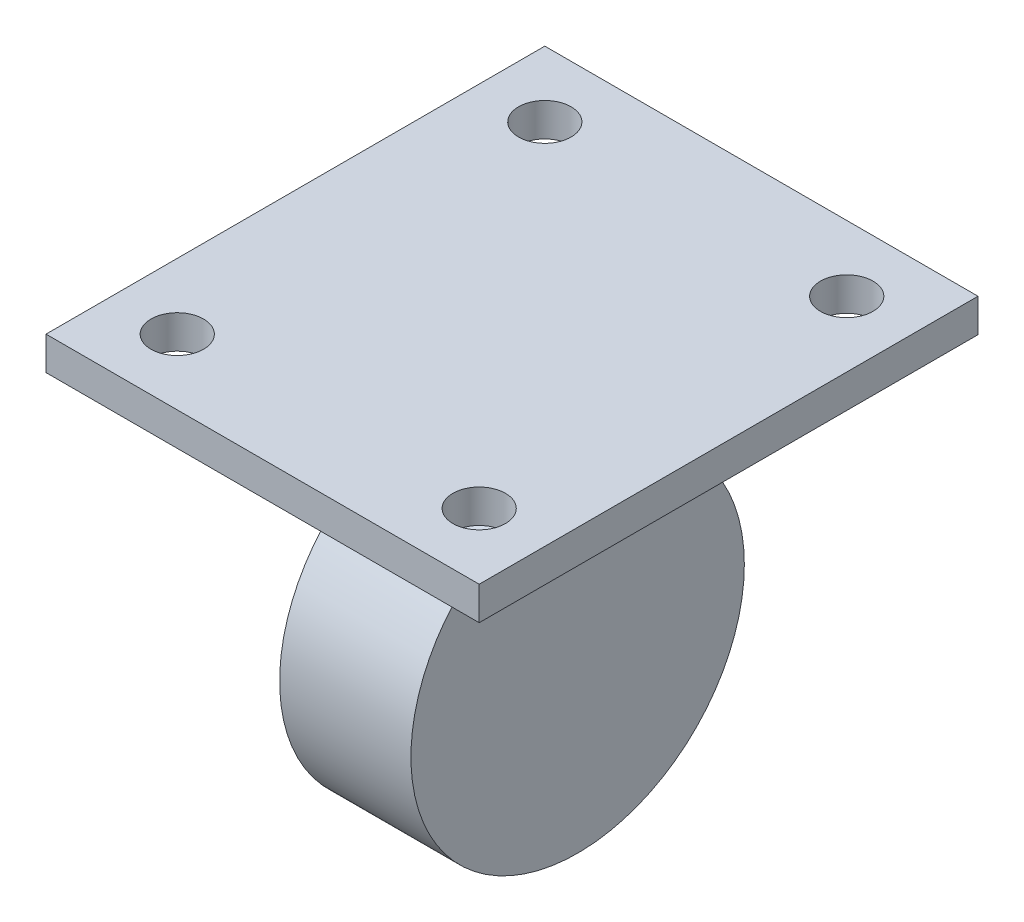
ISO-10303-21;
HEADER;
FILE_DESCRIPTION(('STEP AP214'),'2;1');
FILE_NAME('part.step','',(''),(''),'','','');
FILE_SCHEMA(('AUTOMOTIVE_DESIGN { 1 0 10303 214 1 1 1 1 }'));
ENDSEC;
DATA;
#1=APPLICATION_CONTEXT('core data for automotive mechanical design processes');
#2=APPLICATION_PROTOCOL_DEFINITION('international standard','automotive_design',2000,#1);
#3=PRODUCT_CONTEXT('',#1,'mechanical');
#4=PRODUCT('Part','Part','',(#3));
#5=PRODUCT_RELATED_PRODUCT_CATEGORY('part','',(#4));
#6=PRODUCT_DEFINITION_FORMATION('','',#4);
#7=PRODUCT_DEFINITION_CONTEXT('part definition',#1,'design');
#8=PRODUCT_DEFINITION('design','',#6,#7);
#9=PRODUCT_DEFINITION_SHAPE('','',#8);
#10=(LENGTH_UNIT() NAMED_UNIT(*) SI_UNIT(.MILLI.,.METRE.));
#11=(NAMED_UNIT(*) PLANE_ANGLE_UNIT() SI_UNIT($,.RADIAN.));
#12=(NAMED_UNIT(*) SI_UNIT($,.STERADIAN.) SOLID_ANGLE_UNIT());
#13=UNCERTAINTY_MEASURE_WITH_UNIT(LENGTH_MEASURE(1.E-05),#10,'distance_accuracy_value','');
#14=(GEOMETRIC_REPRESENTATION_CONTEXT(3) GLOBAL_UNCERTAINTY_ASSIGNED_CONTEXT((#13)) GLOBAL_UNIT_ASSIGNED_CONTEXT((#10,
#11,#12)) REPRESENTATION_CONTEXT('',''));
#15=CARTESIAN_POINT('',(0.,0.,0.));
#16=DIRECTION('',(0.,0.,1.));
#17=DIRECTION('',(1.,0.,0.));
#18=AXIS2_PLACEMENT_3D('',#15,#16,#17);
#19=CARTESIAN_POINT('',(5.,-19.8,103.));
#20=DIRECTION('',(-1.,0.,0.));
#21=DIRECTION('',(0.,0.,1.));
#22=AXIS2_PLACEMENT_3D('',#19,#20,#21);
#23=CYLINDRICAL_SURFACE('',#22,12.7);
#24=CARTESIAN_POINT('',(5.,-19.8,103.));
#25=DIRECTION('',(1.,0.,0.));
#26=DIRECTION('',(0.,0.,-1.));
#27=AXIS2_PLACEMENT_3D('',#24,#25,#26);
#28=CIRCLE('',#27,12.7);
#29=CARTESIAN_POINT('',(5.,-19.8,90.3));
#30=VERTEX_POINT('',#29);
#31=EDGE_CURVE('E11',#30,#30,#28,.T.);
#32=ORIENTED_EDGE('',*,*,#31,.F.);
#33=EDGE_LOOP('',(#32));
#34=FACE_BOUND('',#33,.T.);
#35=CARTESIAN_POINT('',(-5.,-19.8,103.));
#36=DIRECTION('',(1.,0.,0.));
#37=DIRECTION('',(0.,0.,-1.));
#38=AXIS2_PLACEMENT_3D('',#35,#36,#37);
#39=CIRCLE('',#38,12.7);
#40=CARTESIAN_POINT('',(-5.,-19.8,90.3));
#41=VERTEX_POINT('',#40);
#42=EDGE_CURVE('E44',#41,#41,#39,.T.);
#43=ORIENTED_EDGE('',*,*,#42,.T.);
#44=EDGE_LOOP('',(#43));
#45=FACE_BOUND('',#44,.T.);
#46=ADVANCED_FACE('F41',(#34,#45),#23,.T.);
#47=CARTESIAN_POINT('',(5.,-19.8,103.));
#48=DIRECTION('',(1.,0.,0.));
#49=DIRECTION('',(0.,0.,-1.));
#50=AXIS2_PLACEMENT_3D('',#47,#48,#49);
#51=PLANE('',#50);
#52=ORIENTED_EDGE('',*,*,#31,.T.);
#53=EDGE_LOOP('',(#52));
#54=FACE_BOUND('',#53,.T.);
#55=ADVANCED_FACE('F56',(#54),#51,.T.);
#56=CARTESIAN_POINT('',(-5.,-19.8,103.));
#57=DIRECTION('',(1.,0.,0.));
#58=DIRECTION('',(0.,0.,-1.));
#59=AXIS2_PLACEMENT_3D('',#56,#57,#58);
#60=PLANE('',#59);
#61=ORIENTED_EDGE('',*,*,#42,.F.);
#62=EDGE_LOOP('',(#61));
#63=FACE_BOUND('',#62,.T.);
#64=ADVANCED_FACE('F54',(#63),#60,.F.);
#65=CLOSED_SHELL('',(#46,#55,#64));
#66=MANIFOLD_SOLID_BREP('B2',#65);
#67=CARTESIAN_POINT('',(-16.5,-2.04000000000001,122.));
#68=DIRECTION('',(-1.,0.,0.));
#69=DIRECTION('',(0.,0.,1.));
#70=AXIS2_PLACEMENT_3D('',#67,#68,#69);
#71=PLANE('',#70);
#72=DIRECTION('',(0.,0.,1.));
#73=VECTOR('',#72,1.);
#74=CARTESIAN_POINT('',(-16.5,0.499999999999994,122.));
#75=LINE('',#74,#73);
#76=CARTESIAN_POINT('',(-16.5,0.499999999999994,84.));
#77=VERTEX_POINT('',#76);
#78=CARTESIAN_POINT('',(-16.5,0.499999999999994,122.));
#79=VERTEX_POINT('',#78);
#80=EDGE_CURVE('E147',#77,#79,#75,.T.);
#81=ORIENTED_EDGE('',*,*,#80,.F.);
#82=DIRECTION('',(0.,1.,0.));
#83=VECTOR('',#82,1.);
#84=CARTESIAN_POINT('',(-16.5,-2.04000000000001,84.));
#85=LINE('',#84,#83);
#86=CARTESIAN_POINT('',(-16.5,-2.04000000000001,84.));
#87=VERTEX_POINT('',#86);
#88=EDGE_CURVE('E39',#87,#77,#85,.T.);
#89=ORIENTED_EDGE('',*,*,#88,.F.);
#90=DIRECTION('',(0.,0.,1.));
#91=VECTOR('',#90,1.);
#92=CARTESIAN_POINT('',(-16.5,-2.04000000000001,122.));
#93=LINE('',#92,#91);
#94=CARTESIAN_POINT('',(-16.5,-2.04000000000001,122.));
#95=VERTEX_POINT('',#94);
#96=EDGE_CURVE('E140',#87,#95,#93,.T.);
#97=ORIENTED_EDGE('',*,*,#96,.T.);
#98=DIRECTION('',(0.,1.,0.));
#99=VECTOR('',#98,1.);
#100=CARTESIAN_POINT('',(-16.5,-2.04000000000001,122.));
#101=LINE('',#100,#99);
#102=EDGE_CURVE('E85',#95,#79,#101,.T.);
#103=ORIENTED_EDGE('',*,*,#102,.T.);
#104=EDGE_LOOP('',(#81,#89,#97,#103));
#105=FACE_BOUND('',#104,.T.);
#106=ADVANCED_FACE('F82',(#105),#71,.T.);
#107=CARTESIAN_POINT('',(-16.5,-2.04000000000001,84.));
#108=DIRECTION('',(0.,0.,-1.));
#109=DIRECTION('',(-1.,0.,0.));
#110=AXIS2_PLACEMENT_3D('',#107,#108,#109);
#111=PLANE('',#110);
#112=DIRECTION('',(-1.,0.,0.));
#113=VECTOR('',#112,1.);
#114=CARTESIAN_POINT('',(-16.5,0.499999999999994,84.));
#115=LINE('',#114,#113);
#116=CARTESIAN_POINT('',(16.5,0.499999999999994,84.));
#117=VERTEX_POINT('',#116);
#118=EDGE_CURVE('E142',#117,#77,#115,.T.);
#119=ORIENTED_EDGE('',*,*,#118,.F.);
#120=DIRECTION('',(0.,1.,0.));
#121=VECTOR('',#120,1.);
#122=CARTESIAN_POINT('',(16.5,-2.04000000000001,84.));
#123=LINE('',#122,#121);
#124=CARTESIAN_POINT('',(16.5,-2.04000000000001,84.));
#125=VERTEX_POINT('',#124);
#126=EDGE_CURVE('E91',#125,#117,#123,.T.);
#127=ORIENTED_EDGE('',*,*,#126,.F.);
#128=DIRECTION('',(-1.,0.,0.));
#129=VECTOR('',#128,1.);
#130=CARTESIAN_POINT('',(-16.5,-2.04000000000001,84.));
#131=LINE('',#130,#129);
#132=EDGE_CURVE('E137',#125,#87,#131,.T.);
#133=ORIENTED_EDGE('',*,*,#132,.T.);
#134=ORIENTED_EDGE('',*,*,#88,.T.);
#135=EDGE_LOOP('',(#119,#127,#133,#134));
#136=FACE_BOUND('',#135,.T.);
#137=ADVANCED_FACE('F158',(#136),#111,.T.);
#138=CARTESIAN_POINT('',(16.5,-2.04000000000001,122.));
#139=DIRECTION('',(1.,0.,0.));
#140=DIRECTION('',(0.,0.,-1.));
#141=AXIS2_PLACEMENT_3D('',#138,#139,#140);
#142=PLANE('',#141);
#143=DIRECTION('',(0.,0.,-1.));
#144=VECTOR('',#143,1.);
#145=CARTESIAN_POINT('',(16.5,0.499999999999994,122.));
#146=LINE('',#145,#144);
#147=CARTESIAN_POINT('',(16.5,0.499999999999994,122.));
#148=VERTEX_POINT('',#147);
#149=EDGE_CURVE('E132',#148,#117,#146,.T.);
#150=ORIENTED_EDGE('',*,*,#149,.F.);
#151=DIRECTION('',(0.,1.,0.));
#152=VECTOR('',#151,1.);
#153=CARTESIAN_POINT('',(16.5,-2.04000000000001,122.));
#154=LINE('',#153,#152);
#155=CARTESIAN_POINT('',(16.5,-2.04000000000001,122.));
#156=VERTEX_POINT('',#155);
#157=EDGE_CURVE('E127',#156,#148,#154,.T.);
#158=ORIENTED_EDGE('',*,*,#157,.F.);
#159=DIRECTION('',(0.,0.,-1.));
#160=VECTOR('',#159,1.);
#161=CARTESIAN_POINT('',(16.5,-2.04000000000001,122.));
#162=LINE('',#161,#160);
#163=EDGE_CURVE('E130',#156,#125,#162,.T.);
#164=ORIENTED_EDGE('',*,*,#163,.T.);
#165=ORIENTED_EDGE('',*,*,#126,.T.);
#166=EDGE_LOOP('',(#150,#158,#164,#165));
#167=FACE_BOUND('',#166,.T.);
#168=ADVANCED_FACE('F129',(#167),#142,.T.);
#169=CARTESIAN_POINT('',(-16.5,-2.04000000000001,122.));
#170=DIRECTION('',(0.,0.,1.));
#171=DIRECTION('',(1.,0.,0.));
#172=AXIS2_PLACEMENT_3D('',#169,#170,#171);
#173=PLANE('',#172);
#174=DIRECTION('',(1.,0.,0.));
#175=VECTOR('',#174,1.);
#176=CARTESIAN_POINT('',(-16.5,0.499999999999994,122.));
#177=LINE('',#176,#175);
#178=EDGE_CURVE('E150',#79,#148,#177,.T.);
#179=ORIENTED_EDGE('',*,*,#178,.F.);
#180=ORIENTED_EDGE('',*,*,#102,.F.);
#181=DIRECTION('',(1.,0.,0.));
#182=VECTOR('',#181,1.);
#183=CARTESIAN_POINT('',(-16.5,-2.04000000000001,122.));
#184=LINE('',#183,#182);
#185=EDGE_CURVE('E136',#95,#156,#184,.T.);
#186=ORIENTED_EDGE('',*,*,#185,.T.);
#187=ORIENTED_EDGE('',*,*,#157,.T.);
#188=EDGE_LOOP('',(#179,#180,#186,#187));
#189=FACE_BOUND('',#188,.T.);
#190=ADVANCED_FACE('F139',(#189),#173,.T.);
#191=CARTESIAN_POINT('',(0.,-2.04000000000001,0.));
#192=DIRECTION('',(0.,-1.,0.));
#193=DIRECTION('',(0.,0.,-1.));
#194=AXIS2_PLACEMENT_3D('',#191,#192,#193);
#195=PLANE('',#194);
#196=CARTESIAN_POINT('',(11.5,-2.04000000000001,117.));
#197=DIRECTION('',(0.,1.,0.));
#198=DIRECTION('',(0.,0.,1.));
#199=AXIS2_PLACEMENT_3D('',#196,#197,#198);
#200=CIRCLE('',#199,2.);
#201=CARTESIAN_POINT('',(11.5,-2.04000000000001,119.));
#202=VERTEX_POINT('',#201);
#203=EDGE_CURVE('E199',#202,#202,#200,.T.);
#204=ORIENTED_EDGE('',*,*,#203,.T.);
#205=EDGE_LOOP('',(#204));
#206=FACE_BOUND('',#205,.T.);
#207=CARTESIAN_POINT('',(11.5,-2.04000000000001,89.));
#208=DIRECTION('',(0.,1.,0.));
#209=DIRECTION('',(0.,0.,1.));
#210=AXIS2_PLACEMENT_3D('',#207,#208,#209);
#211=CIRCLE('',#210,2.);
#212=CARTESIAN_POINT('',(11.5,-2.04000000000001,91.));
#213=VERTEX_POINT('',#212);
#214=EDGE_CURVE('E207',#213,#213,#211,.T.);
#215=ORIENTED_EDGE('',*,*,#214,.T.);
#216=EDGE_LOOP('',(#215));
#217=FACE_BOUND('',#216,.T.);
#218=CARTESIAN_POINT('',(-11.5,-2.04000000000001,89.));
#219=DIRECTION('',(0.,1.,0.));
#220=DIRECTION('',(0.,0.,1.));
#221=AXIS2_PLACEMENT_3D('',#218,#219,#220);
#222=CIRCLE('',#221,2.);
#223=CARTESIAN_POINT('',(-11.5,-2.04000000000001,91.));
#224=VERTEX_POINT('',#223);
#225=EDGE_CURVE('E213',#224,#224,#222,.T.);
#226=ORIENTED_EDGE('',*,*,#225,.T.);
#227=EDGE_LOOP('',(#226));
#228=FACE_BOUND('',#227,.T.);
#229=CARTESIAN_POINT('',(-11.5,-2.04000000000001,117.));
#230=DIRECTION('',(0.,1.,0.));
#231=DIRECTION('',(0.,0.,1.));
#232=AXIS2_PLACEMENT_3D('',#229,#230,#231);
#233=CIRCLE('',#232,2.);
#234=CARTESIAN_POINT('',(-11.5,-2.04000000000001,119.));
#235=VERTEX_POINT('',#234);
#236=EDGE_CURVE('E151',#235,#235,#233,.T.);
#237=ORIENTED_EDGE('',*,*,#236,.T.);
#238=EDGE_LOOP('',(#237));
#239=FACE_BOUND('',#238,.T.);
#240=ORIENTED_EDGE('',*,*,#96,.F.);
#241=ORIENTED_EDGE('',*,*,#132,.F.);
#242=ORIENTED_EDGE('',*,*,#163,.F.);
#243=ORIENTED_EDGE('',*,*,#185,.F.);
#244=EDGE_LOOP('',(#240,#241,#242,#243));
#245=FACE_BOUND('',#244,.T.);
#246=ADVANCED_FACE('F135',(#206,#217,#228,#239,#245),#195,.T.);
#247=CARTESIAN_POINT('',(0.,0.499999999999994,0.));
#248=DIRECTION('',(0.,-1.,0.));
#249=DIRECTION('',(0.,0.,-1.));
#250=AXIS2_PLACEMENT_3D('',#247,#248,#249);
#251=PLANE('',#250);
#252=CARTESIAN_POINT('',(11.5,0.499999999999994,117.));
#253=DIRECTION('',(0.,1.,0.));
#254=DIRECTION('',(0.,0.,1.));
#255=AXIS2_PLACEMENT_3D('',#252,#253,#254);
#256=CIRCLE('',#255,2.);
#257=CARTESIAN_POINT('',(11.5,0.499999999999994,119.));
#258=VERTEX_POINT('',#257);
#259=EDGE_CURVE('E202',#258,#258,#256,.T.);
#260=ORIENTED_EDGE('',*,*,#259,.F.);
#261=EDGE_LOOP('',(#260));
#262=FACE_BOUND('',#261,.T.);
#263=CARTESIAN_POINT('',(11.5,0.499999999999994,89.));
#264=DIRECTION('',(0.,1.,0.));
#265=DIRECTION('',(0.,0.,1.));
#266=AXIS2_PLACEMENT_3D('',#263,#264,#265);
#267=CIRCLE('',#266,2.);
#268=CARTESIAN_POINT('',(11.5,0.499999999999994,91.));
#269=VERTEX_POINT('',#268);
#270=EDGE_CURVE('E204',#269,#269,#267,.T.);
#271=ORIENTED_EDGE('',*,*,#270,.F.);
#272=EDGE_LOOP('',(#271));
#273=FACE_BOUND('',#272,.T.);
#274=CARTESIAN_POINT('',(-11.5,0.499999999999994,89.));
#275=DIRECTION('',(0.,1.,0.));
#276=DIRECTION('',(0.,0.,1.));
#277=AXIS2_PLACEMENT_3D('',#274,#275,#276);
#278=CIRCLE('',#277,2.);
#279=CARTESIAN_POINT('',(-11.5,0.499999999999994,91.));
#280=VERTEX_POINT('',#279);
#281=EDGE_CURVE('E210',#280,#280,#278,.T.);
#282=ORIENTED_EDGE('',*,*,#281,.F.);
#283=EDGE_LOOP('',(#282));
#284=FACE_BOUND('',#283,.T.);
#285=CARTESIAN_POINT('',(-11.5,0.499999999999994,117.));
#286=DIRECTION('',(0.,1.,0.));
#287=DIRECTION('',(0.,0.,1.));
#288=AXIS2_PLACEMENT_3D('',#285,#286,#287);
#289=CIRCLE('',#288,2.);
#290=CARTESIAN_POINT('',(-11.5,0.499999999999994,119.));
#291=VERTEX_POINT('',#290);
#292=EDGE_CURVE('E216',#291,#291,#289,.T.);
#293=ORIENTED_EDGE('',*,*,#292,.F.);
#294=EDGE_LOOP('',(#293));
#295=FACE_BOUND('',#294,.T.);
#296=ORIENTED_EDGE('',*,*,#80,.T.);
#297=ORIENTED_EDGE('',*,*,#178,.T.);
#298=ORIENTED_EDGE('',*,*,#149,.T.);
#299=ORIENTED_EDGE('',*,*,#118,.T.);
#300=EDGE_LOOP('',(#296,#297,#298,#299));
#301=FACE_BOUND('',#300,.T.);
#302=ADVANCED_FACE('F157',(#262,#273,#284,#295,#301),#251,.F.);
#303=CARTESIAN_POINT('',(-11.5,-2.04000000000001,117.));
#304=DIRECTION('',(0.,1.,0.));
#305=DIRECTION('',(0.,0.,1.));
#306=AXIS2_PLACEMENT_3D('',#303,#304,#305);
#307=CYLINDRICAL_SURFACE('',#306,2.);
#308=ORIENTED_EDGE('',*,*,#236,.F.);
#309=EDGE_LOOP('',(#308));
#310=FACE_BOUND('',#309,.T.);
#311=ORIENTED_EDGE('',*,*,#292,.T.);
#312=EDGE_LOOP('',(#311));
#313=FACE_BOUND('',#312,.T.);
#314=ADVANCED_FACE('F176',(#310,#313),#307,.F.);
#315=CARTESIAN_POINT('',(-11.5,-2.04000000000001,89.));
#316=DIRECTION('',(0.,1.,0.));
#317=DIRECTION('',(0.,0.,1.));
#318=AXIS2_PLACEMENT_3D('',#315,#316,#317);
#319=CYLINDRICAL_SURFACE('',#318,2.);
#320=ORIENTED_EDGE('',*,*,#225,.F.);
#321=EDGE_LOOP('',(#320));
#322=FACE_BOUND('',#321,.T.);
#323=ORIENTED_EDGE('',*,*,#281,.T.);
#324=EDGE_LOOP('',(#323));
#325=FACE_BOUND('',#324,.T.);
#326=ADVANCED_FACE('F183',(#322,#325),#319,.F.);
#327=CARTESIAN_POINT('',(11.5,-2.04000000000001,89.));
#328=DIRECTION('',(0.,1.,0.));
#329=DIRECTION('',(0.,0.,1.));
#330=AXIS2_PLACEMENT_3D('',#327,#328,#329);
#331=CYLINDRICAL_SURFACE('',#330,2.);
#332=ORIENTED_EDGE('',*,*,#214,.F.);
#333=EDGE_LOOP('',(#332));
#334=FACE_BOUND('',#333,.T.);
#335=ORIENTED_EDGE('',*,*,#270,.T.);
#336=EDGE_LOOP('',(#335));
#337=FACE_BOUND('',#336,.T.);
#338=ADVANCED_FACE('F187',(#334,#337),#331,.F.);
#339=CARTESIAN_POINT('',(11.5,-2.04000000000001,117.));
#340=DIRECTION('',(0.,1.,0.));
#341=DIRECTION('',(0.,0.,1.));
#342=AXIS2_PLACEMENT_3D('',#339,#340,#341);
#343=CYLINDRICAL_SURFACE('',#342,2.);
#344=ORIENTED_EDGE('',*,*,#203,.F.);
#345=EDGE_LOOP('',(#344));
#346=FACE_BOUND('',#345,.T.);
#347=ORIENTED_EDGE('',*,*,#259,.T.);
#348=EDGE_LOOP('',(#347));
#349=FACE_BOUND('',#348,.T.);
#350=ADVANCED_FACE('F191',(#346,#349),#343,.F.);
#351=CLOSED_SHELL('',(#106,#137,#168,#190,#246,#302,#314,#326,#338,#350));
#352=MANIFOLD_SOLID_BREP('B6',#351);
#353=ADVANCED_BREP_SHAPE_REPRESENTATION('',(#18,#66,#352),#14);
#354=SHAPE_DEFINITION_REPRESENTATION(#9,#353);
ENDSEC;
END-ISO-10303-21;
